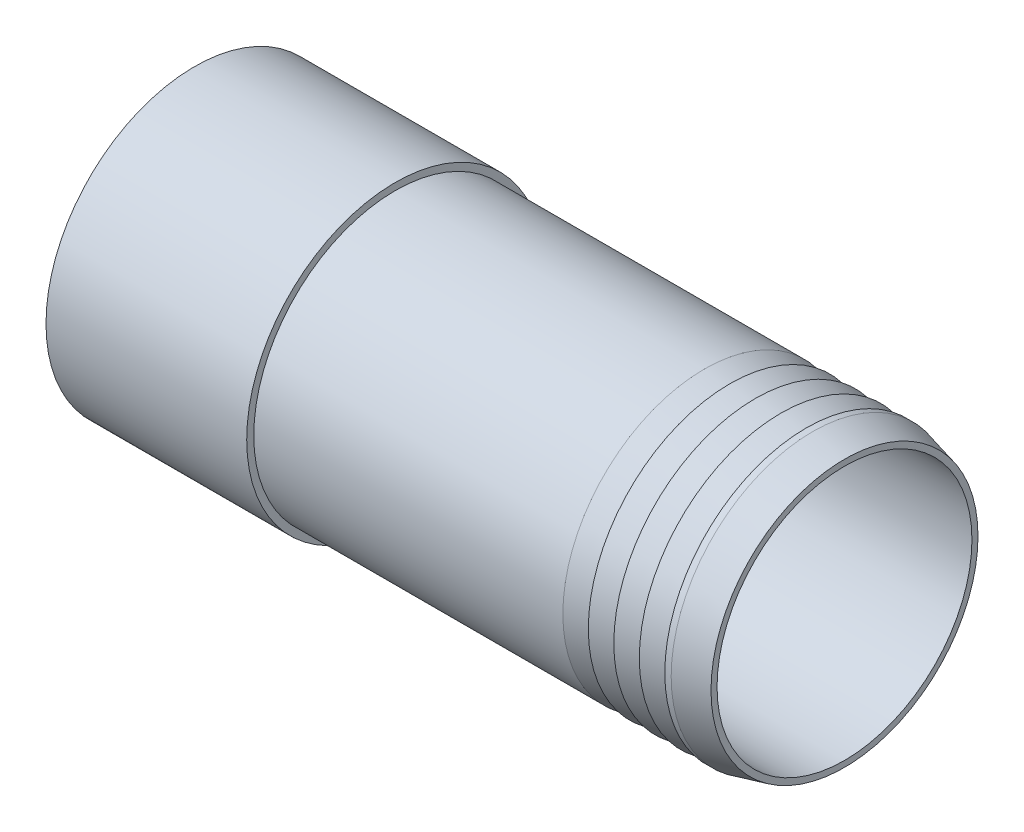
ISO-10303-21;
HEADER;
FILE_DESCRIPTION(('STEP AP214'),'2;1');
FILE_NAME('part.step','',(''),(''),'','','');
FILE_SCHEMA(('AUTOMOTIVE_DESIGN { 1 0 10303 214 1 1 1 1 }'));
ENDSEC;
DATA;
#1=APPLICATION_CONTEXT('core data for automotive mechanical design processes');
#2=APPLICATION_PROTOCOL_DEFINITION('international standard','automotive_design',2000,#1);
#3=PRODUCT_CONTEXT('',#1,'mechanical');
#4=PRODUCT('Part','Part','',(#3));
#5=PRODUCT_RELATED_PRODUCT_CATEGORY('part','',(#4));
#6=PRODUCT_DEFINITION_FORMATION('','',#4);
#7=PRODUCT_DEFINITION_CONTEXT('part definition',#1,'design');
#8=PRODUCT_DEFINITION('design','',#6,#7);
#9=PRODUCT_DEFINITION_SHAPE('','',#8);
#10=(LENGTH_UNIT() NAMED_UNIT(*) SI_UNIT(.MILLI.,.METRE.));
#11=(NAMED_UNIT(*) PLANE_ANGLE_UNIT() SI_UNIT($,.RADIAN.));
#12=(NAMED_UNIT(*) SI_UNIT($,.STERADIAN.) SOLID_ANGLE_UNIT());
#13=UNCERTAINTY_MEASURE_WITH_UNIT(LENGTH_MEASURE(1.E-05),#10,'distance_accuracy_value','');
#14=(GEOMETRIC_REPRESENTATION_CONTEXT(3) GLOBAL_UNCERTAINTY_ASSIGNED_CONTEXT((#13)) GLOBAL_UNIT_ASSIGNED_CONTEXT((#10,
#11,#12)) REPRESENTATION_CONTEXT('',''));
#15=CARTESIAN_POINT('',(0.,0.,0.));
#16=DIRECTION('',(0.,0.,1.));
#17=DIRECTION('',(1.,0.,0.));
#18=AXIS2_PLACEMENT_3D('',#15,#16,#17);
#19=CARTESIAN_POINT('',(-45.72,7.18,0.));
#20=DIRECTION('',(1.,0.,0.));
#21=DIRECTION('',(0.,0.,-1.));
#22=AXIS2_PLACEMENT_3D('',#19,#20,#21);
#23=PLANE('',#22);
#24=CARTESIAN_POINT('',(-45.72,-7.62,0.));
#25=DIRECTION('',(-1.,0.,0.));
#26=DIRECTION('',(0.,0.,1.));
#27=AXIS2_PLACEMENT_3D('',#24,#25,#26);
#28=CIRCLE('',#27,12.7);
#29=CARTESIAN_POINT('',(-45.72,-7.62,12.7));
#30=VERTEX_POINT('',#29);
#31=EDGE_CURVE('E56',#30,#30,#28,.T.);
#32=ORIENTED_EDGE('',*,*,#31,.F.);
#33=EDGE_LOOP('',(#32));
#34=FACE_BOUND('',#33,.T.);
#35=CARTESIAN_POINT('',(-45.72,-7.62,0.));
#36=DIRECTION('',(-1.,0.,0.));
#37=DIRECTION('',(0.,0.,1.));
#38=AXIS2_PLACEMENT_3D('',#35,#36,#37);
#39=CIRCLE('',#38,14.8);
#40=CARTESIAN_POINT('',(-45.72,-7.62,14.8));
#41=VERTEX_POINT('',#40);
#42=EDGE_CURVE('E111',#41,#41,#39,.T.);
#43=ORIENTED_EDGE('',*,*,#42,.T.);
#44=EDGE_LOOP('',(#43));
#45=FACE_BOUND('',#44,.T.);
#46=ADVANCED_FACE('F43',(#34,#45),#23,.F.);
#47=CARTESIAN_POINT('',(0.,-7.62,0.));
#48=DIRECTION('',(-1.,0.,0.));
#49=DIRECTION('',(0.,0.,1.));
#50=AXIS2_PLACEMENT_3D('',#47,#48,#49);
#51=CYLINDRICAL_SURFACE('',#50,12.7);
#52=CARTESIAN_POINT('',(19.05,-7.62,0.));
#53=DIRECTION('',(-1.,0.,0.));
#54=DIRECTION('',(0.,0.,1.));
#55=AXIS2_PLACEMENT_3D('',#52,#53,#54);
#56=CIRCLE('',#55,12.7);
#57=CARTESIAN_POINT('',(19.05,-7.62,12.7));
#58=VERTEX_POINT('',#57);
#59=EDGE_CURVE('E61',#58,#58,#56,.T.);
#60=ORIENTED_EDGE('',*,*,#59,.F.);
#61=EDGE_LOOP('',(#60));
#62=FACE_BOUND('',#61,.T.);
#63=ORIENTED_EDGE('',*,*,#31,.T.);
#64=EDGE_LOOP('',(#63));
#65=FACE_BOUND('',#64,.T.);
#66=ADVANCED_FACE('F191',(#62,#65),#51,.F.);
#67=CARTESIAN_POINT('',(19.05,5.08,0.));
#68=DIRECTION('',(-1.,0.,0.));
#69=DIRECTION('',(0.,0.,1.));
#70=AXIS2_PLACEMENT_3D('',#67,#68,#69);
#71=PLANE('',#70);
#72=CARTESIAN_POINT('',(19.05,-7.62,0.));
#73=DIRECTION('',(-1.,0.,0.));
#74=DIRECTION('',(0.,0.,1.));
#75=AXIS2_PLACEMENT_3D('',#72,#73,#74);
#76=CIRCLE('',#75,13.30325);
#77=CARTESIAN_POINT('',(19.05,-7.62,13.30325));
#78=VERTEX_POINT('',#77);
#79=EDGE_CURVE('E10',#78,#78,#76,.F.);
#80=ORIENTED_EDGE('',*,*,#79,.T.);
#81=EDGE_LOOP('',(#80));
#82=FACE_BOUND('',#81,.T.);
#83=ORIENTED_EDGE('',*,*,#59,.T.);
#84=EDGE_LOOP('',(#83));
#85=FACE_BOUND('',#84,.T.);
#86=ADVANCED_FACE('F185',(#82,#85),#71,.F.);
#87=CARTESIAN_POINT('',(0.,-7.62,0.));
#88=DIRECTION('',(-1.,0.,0.));
#89=DIRECTION('',(0.,0.,1.));
#90=AXIS2_PLACEMENT_3D('',#87,#88,#89);
#91=CYLINDRICAL_SURFACE('',#90,14.097);
#92=CARTESIAN_POINT('',(15.875,-7.62,0.));
#93=DIRECTION('',(-1.,0.,0.));
#94=DIRECTION('',(0.,0.,1.));
#95=AXIS2_PLACEMENT_3D('',#92,#93,#94);
#96=CIRCLE('',#95,14.097);
#97=CARTESIAN_POINT('',(15.875,-7.62,14.097));
#98=VERTEX_POINT('',#97);
#99=EDGE_CURVE('E51',#98,#98,#96,.T.);
#100=ORIENTED_EDGE('',*,*,#99,.T.);
#101=EDGE_LOOP('',(#100));
#102=FACE_BOUND('',#101,.T.);
#103=CARTESIAN_POINT('',(15.24,-7.62,0.));
#104=DIRECTION('',(-1.,0.,0.));
#105=DIRECTION('',(0.,0.,1.));
#106=AXIS2_PLACEMENT_3D('',#103,#104,#105);
#107=CIRCLE('',#106,14.097);
#108=CARTESIAN_POINT('',(15.24,-7.62,14.097));
#109=VERTEX_POINT('',#108);
#110=EDGE_CURVE('E67',#109,#109,#107,.T.);
#111=ORIENTED_EDGE('',*,*,#110,.F.);
#112=EDGE_LOOP('',(#111));
#113=FACE_BOUND('',#112,.T.);
#114=ADVANCED_FACE('F180',(#102,#113),#91,.T.);
#115=CARTESIAN_POINT('',(15.24,6.477,0.));
#116=DIRECTION('',(1.,0.,0.));
#117=DIRECTION('',(0.,0.,-1.));
#118=AXIS2_PLACEMENT_3D('',#115,#116,#117);
#119=PLANE('',#118);
#120=CARTESIAN_POINT('',(15.24,-7.62,0.));
#121=DIRECTION('',(-1.,0.,0.));
#122=DIRECTION('',(0.,0.,1.));
#123=AXIS2_PLACEMENT_3D('',#120,#121,#122);
#124=CIRCLE('',#123,13.462);
#125=CARTESIAN_POINT('',(15.24,-7.62,13.462));
#126=VERTEX_POINT('',#125);
#127=EDGE_CURVE('E71',#126,#126,#124,.T.);
#128=ORIENTED_EDGE('',*,*,#127,.F.);
#129=EDGE_LOOP('',(#128));
#130=FACE_BOUND('',#129,.T.);
#131=ORIENTED_EDGE('',*,*,#110,.T.);
#132=EDGE_LOOP('',(#131));
#133=FACE_BOUND('',#132,.T.);
#134=ADVANCED_FACE('F174',(#130,#133),#119,.F.);
#135=CARTESIAN_POINT('',(15.24,-7.62,0.));
#136=DIRECTION('',(-1.,0.,0.));
#137=DIRECTION('',(0.,0.,1.));
#138=AXIS2_PLACEMENT_3D('',#135,#136,#137);
#139=CONICAL_SURFACE('',#138,13.462,0.244978663126864);
#140=CARTESIAN_POINT('',(12.7,-7.62,0.));
#141=DIRECTION('',(-1.,0.,0.));
#142=DIRECTION('',(0.,0.,1.));
#143=AXIS2_PLACEMENT_3D('',#140,#141,#142);
#144=CIRCLE('',#143,14.097);
#145=CARTESIAN_POINT('',(12.7,-7.62,14.097));
#146=VERTEX_POINT('',#145);
#147=EDGE_CURVE('E75',#146,#146,#144,.T.);
#148=ORIENTED_EDGE('',*,*,#147,.F.);
#149=EDGE_LOOP('',(#148));
#150=FACE_BOUND('',#149,.T.);
#151=ORIENTED_EDGE('',*,*,#127,.T.);
#152=EDGE_LOOP('',(#151));
#153=FACE_BOUND('',#152,.T.);
#154=ADVANCED_FACE('F168',(#150,#153),#139,.T.);
#155=CARTESIAN_POINT('',(12.7,6.477,0.));
#156=DIRECTION('',(1.,0.,0.));
#157=DIRECTION('',(0.,0.,-1.));
#158=AXIS2_PLACEMENT_3D('',#155,#156,#157);
#159=PLANE('',#158);
#160=CARTESIAN_POINT('',(12.7,-7.62,0.));
#161=DIRECTION('',(-1.,0.,0.));
#162=DIRECTION('',(0.,0.,1.));
#163=AXIS2_PLACEMENT_3D('',#160,#161,#162);
#164=CIRCLE('',#163,13.462);
#165=CARTESIAN_POINT('',(12.7,-7.62,13.462));
#166=VERTEX_POINT('',#165);
#167=EDGE_CURVE('E79',#166,#166,#164,.T.);
#168=ORIENTED_EDGE('',*,*,#167,.F.);
#169=EDGE_LOOP('',(#168));
#170=FACE_BOUND('',#169,.T.);
#171=ORIENTED_EDGE('',*,*,#147,.T.);
#172=EDGE_LOOP('',(#171));
#173=FACE_BOUND('',#172,.T.);
#174=ADVANCED_FACE('F162',(#170,#173),#159,.F.);
#175=CARTESIAN_POINT('',(12.7,-7.62,0.));
#176=DIRECTION('',(-1.,0.,0.));
#177=DIRECTION('',(0.,0.,1.));
#178=AXIS2_PLACEMENT_3D('',#175,#176,#177);
#179=CONICAL_SURFACE('',#178,13.462,0.244978663126864);
#180=CARTESIAN_POINT('',(10.16,-7.62,0.));
#181=DIRECTION('',(-1.,0.,0.));
#182=DIRECTION('',(0.,0.,1.));
#183=AXIS2_PLACEMENT_3D('',#180,#181,#182);
#184=CIRCLE('',#183,14.097);
#185=CARTESIAN_POINT('',(10.16,-7.62,14.097));
#186=VERTEX_POINT('',#185);
#187=EDGE_CURVE('E83',#186,#186,#184,.T.);
#188=ORIENTED_EDGE('',*,*,#187,.F.);
#189=EDGE_LOOP('',(#188));
#190=FACE_BOUND('',#189,.T.);
#191=ORIENTED_EDGE('',*,*,#167,.T.);
#192=EDGE_LOOP('',(#191));
#193=FACE_BOUND('',#192,.T.);
#194=ADVANCED_FACE('F156',(#190,#193),#179,.T.);
#195=CARTESIAN_POINT('',(10.16,6.477,0.));
#196=DIRECTION('',(1.,0.,0.));
#197=DIRECTION('',(0.,0.,-1.));
#198=AXIS2_PLACEMENT_3D('',#195,#196,#197);
#199=PLANE('',#198);
#200=CARTESIAN_POINT('',(10.16,-7.62,0.));
#201=DIRECTION('',(-1.,0.,0.));
#202=DIRECTION('',(0.,0.,1.));
#203=AXIS2_PLACEMENT_3D('',#200,#201,#202);
#204=CIRCLE('',#203,13.462);
#205=CARTESIAN_POINT('',(10.16,-7.62,13.462));
#206=VERTEX_POINT('',#205);
#207=EDGE_CURVE('E87',#206,#206,#204,.T.);
#208=ORIENTED_EDGE('',*,*,#207,.F.);
#209=EDGE_LOOP('',(#208));
#210=FACE_BOUND('',#209,.T.);
#211=ORIENTED_EDGE('',*,*,#187,.T.);
#212=EDGE_LOOP('',(#211));
#213=FACE_BOUND('',#212,.T.);
#214=ADVANCED_FACE('F150',(#210,#213),#199,.F.);
#215=CARTESIAN_POINT('',(10.16,-7.62,0.));
#216=DIRECTION('',(-1.,0.,0.));
#217=DIRECTION('',(0.,0.,1.));
#218=AXIS2_PLACEMENT_3D('',#215,#216,#217);
#219=CONICAL_SURFACE('',#218,13.462,0.244978663126865);
#220=CARTESIAN_POINT('',(7.62,-7.62,0.));
#221=DIRECTION('',(-1.,0.,0.));
#222=DIRECTION('',(0.,0.,1.));
#223=AXIS2_PLACEMENT_3D('',#220,#221,#222);
#224=CIRCLE('',#223,14.097);
#225=CARTESIAN_POINT('',(7.62,-7.62,14.097));
#226=VERTEX_POINT('',#225);
#227=EDGE_CURVE('E91',#226,#226,#224,.T.);
#228=ORIENTED_EDGE('',*,*,#227,.F.);
#229=EDGE_LOOP('',(#228));
#230=FACE_BOUND('',#229,.T.);
#231=ORIENTED_EDGE('',*,*,#207,.T.);
#232=EDGE_LOOP('',(#231));
#233=FACE_BOUND('',#232,.T.);
#234=ADVANCED_FACE('F144',(#230,#233),#219,.T.);
#235=CARTESIAN_POINT('',(7.62,6.477,0.));
#236=DIRECTION('',(1.,0.,0.));
#237=DIRECTION('',(0.,0.,-1.));
#238=AXIS2_PLACEMENT_3D('',#235,#236,#237);
#239=PLANE('',#238);
#240=CARTESIAN_POINT('',(7.62,-7.62,0.));
#241=DIRECTION('',(-1.,0.,0.));
#242=DIRECTION('',(0.,0.,1.));
#243=AXIS2_PLACEMENT_3D('',#240,#241,#242);
#244=CIRCLE('',#243,13.462);
#245=CARTESIAN_POINT('',(7.62,-7.62,13.462));
#246=VERTEX_POINT('',#245);
#247=EDGE_CURVE('E95',#246,#246,#244,.T.);
#248=ORIENTED_EDGE('',*,*,#247,.F.);
#249=EDGE_LOOP('',(#248));
#250=FACE_BOUND('',#249,.T.);
#251=ORIENTED_EDGE('',*,*,#227,.T.);
#252=EDGE_LOOP('',(#251));
#253=FACE_BOUND('',#252,.T.);
#254=ADVANCED_FACE('F138',(#250,#253),#239,.F.);
#255=CARTESIAN_POINT('',(7.62,-7.62,0.));
#256=DIRECTION('',(-1.,0.,0.));
#257=DIRECTION('',(0.,0.,1.));
#258=AXIS2_PLACEMENT_3D('',#255,#256,#257);
#259=CONICAL_SURFACE('',#258,13.462,0.244978663126864);
#260=CARTESIAN_POINT('',(5.08,-7.62,0.));
#261=DIRECTION('',(-1.,0.,0.));
#262=DIRECTION('',(0.,0.,1.));
#263=AXIS2_PLACEMENT_3D('',#260,#261,#262);
#264=CIRCLE('',#263,14.097);
#265=CARTESIAN_POINT('',(5.08,-7.62,14.097));
#266=VERTEX_POINT('',#265);
#267=EDGE_CURVE('E99',#266,#266,#264,.T.);
#268=ORIENTED_EDGE('',*,*,#267,.F.);
#269=EDGE_LOOP('',(#268));
#270=FACE_BOUND('',#269,.T.);
#271=ORIENTED_EDGE('',*,*,#247,.T.);
#272=EDGE_LOOP('',(#271));
#273=FACE_BOUND('',#272,.T.);
#274=ADVANCED_FACE('F132',(#270,#273),#259,.T.);
#275=CARTESIAN_POINT('',(0.,-7.62,0.));
#276=DIRECTION('',(-1.,0.,0.));
#277=DIRECTION('',(0.,0.,1.));
#278=AXIS2_PLACEMENT_3D('',#275,#276,#277);
#279=CYLINDRICAL_SURFACE('',#278,14.097);
#280=CARTESIAN_POINT('',(-25.72,-7.62,0.));
#281=DIRECTION('',(-1.,0.,0.));
#282=DIRECTION('',(0.,0.,1.));
#283=AXIS2_PLACEMENT_3D('',#280,#281,#282);
#284=CIRCLE('',#283,14.097);
#285=CARTESIAN_POINT('',(-25.72,-7.62,14.097));
#286=VERTEX_POINT('',#285);
#287=EDGE_CURVE('E103',#286,#286,#284,.T.);
#288=ORIENTED_EDGE('',*,*,#287,.F.);
#289=EDGE_LOOP('',(#288));
#290=FACE_BOUND('',#289,.T.);
#291=ORIENTED_EDGE('',*,*,#267,.T.);
#292=EDGE_LOOP('',(#291));
#293=FACE_BOUND('',#292,.T.);
#294=ADVANCED_FACE('F126',(#290,#293),#279,.T.);
#295=CARTESIAN_POINT('',(-25.72,6.477,0.));
#296=DIRECTION('',(-1.,0.,0.));
#297=DIRECTION('',(0.,0.,1.));
#298=AXIS2_PLACEMENT_3D('',#295,#296,#297);
#299=PLANE('',#298);
#300=CARTESIAN_POINT('',(-25.72,-7.62,0.));
#301=DIRECTION('',(-1.,0.,0.));
#302=DIRECTION('',(0.,0.,1.));
#303=AXIS2_PLACEMENT_3D('',#300,#301,#302);
#304=CIRCLE('',#303,14.8);
#305=CARTESIAN_POINT('',(-25.72,-7.62,14.8));
#306=VERTEX_POINT('',#305);
#307=EDGE_CURVE('E107',#306,#306,#304,.T.);
#308=ORIENTED_EDGE('',*,*,#307,.F.);
#309=EDGE_LOOP('',(#308));
#310=FACE_BOUND('',#309,.T.);
#311=ORIENTED_EDGE('',*,*,#287,.T.);
#312=EDGE_LOOP('',(#311));
#313=FACE_BOUND('',#312,.T.);
#314=ADVANCED_FACE('F120',(#310,#313),#299,.F.);
#315=CARTESIAN_POINT('',(0.,-7.62,0.));
#316=DIRECTION('',(-1.,0.,0.));
#317=DIRECTION('',(0.,0.,1.));
#318=AXIS2_PLACEMENT_3D('',#315,#316,#317);
#319=CYLINDRICAL_SURFACE('',#318,14.8);
#320=ORIENTED_EDGE('',*,*,#42,.F.);
#321=EDGE_LOOP('',(#320));
#322=FACE_BOUND('',#321,.T.);
#323=ORIENTED_EDGE('',*,*,#307,.T.);
#324=EDGE_LOOP('',(#323));
#325=FACE_BOUND('',#324,.T.);
#326=ADVANCED_FACE('F117',(#322,#325),#319,.T.);
#327=CARTESIAN_POINT('',(15.875,-7.62,0.));
#328=DIRECTION('',(-1.,0.,0.));
#329=DIRECTION('',(0.,0.,1.));
#330=AXIS2_PLACEMENT_3D('',#327,#328,#329);
#331=CONICAL_SURFACE('',#330,14.097,0.244978663126861);
#332=ORIENTED_EDGE('',*,*,#79,.F.);
#333=EDGE_LOOP('',(#332));
#334=FACE_BOUND('',#333,.T.);
#335=ORIENTED_EDGE('',*,*,#99,.F.);
#336=EDGE_LOOP('',(#335));
#337=FACE_BOUND('',#336,.T.);
#338=ADVANCED_FACE('F45',(#334,#337),#331,.T.);
#339=CLOSED_SHELL('',(#46,#66,#86,#114,#134,#154,#174,#194,#214,#234,#254,#274,#294,#314,#326,#338));
#340=MANIFOLD_SOLID_BREP('B2',#339);
#341=ADVANCED_BREP_SHAPE_REPRESENTATION('',(#18,#340),#14);
#342=SHAPE_DEFINITION_REPRESENTATION(#9,#341);
ENDSEC;
END-ISO-10303-21;
